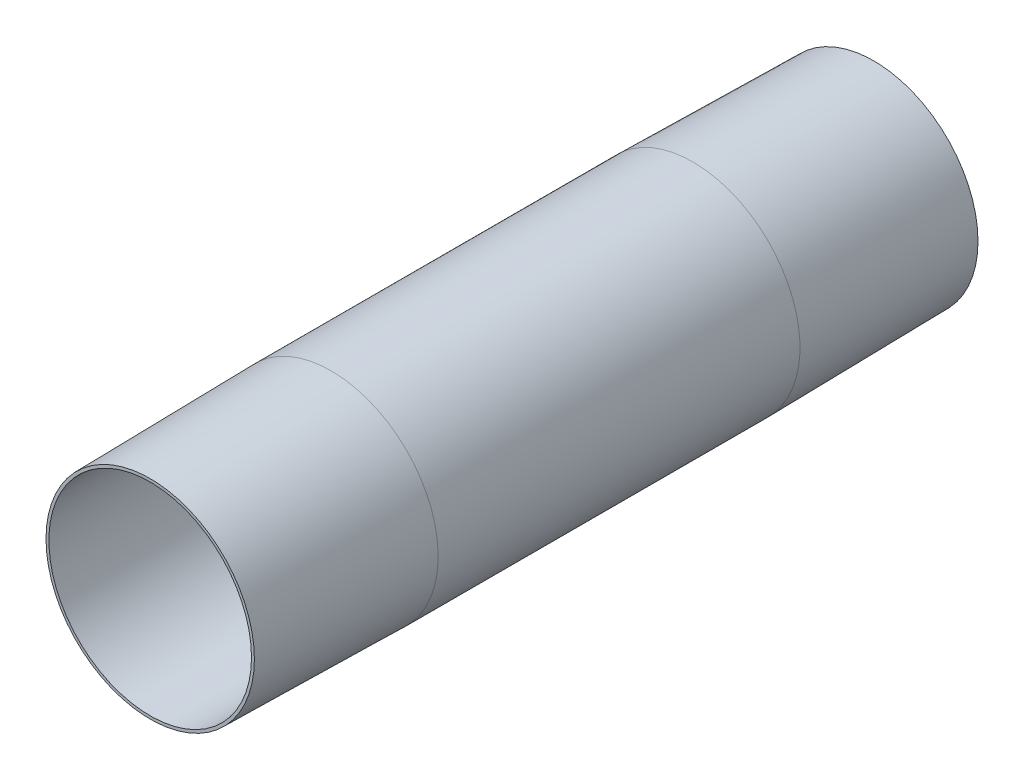
ISO-10303-21;
HEADER;
FILE_DESCRIPTION(('STEP AP214'),'2;1');
FILE_NAME('part.step','',(''),(''),'','','');
FILE_SCHEMA(('AUTOMOTIVE_DESIGN { 1 0 10303 214 1 1 1 1 }'));
ENDSEC;
DATA;
#1=APPLICATION_CONTEXT('core data for automotive mechanical design processes');
#2=APPLICATION_PROTOCOL_DEFINITION('international standard','automotive_design',2000,#1);
#3=PRODUCT_CONTEXT('',#1,'mechanical');
#4=PRODUCT('Part','Part','',(#3));
#5=PRODUCT_RELATED_PRODUCT_CATEGORY('part','',(#4));
#6=PRODUCT_DEFINITION_FORMATION('','',#4);
#7=PRODUCT_DEFINITION_CONTEXT('part definition',#1,'design');
#8=PRODUCT_DEFINITION('design','',#6,#7);
#9=PRODUCT_DEFINITION_SHAPE('','',#8);
#10=(LENGTH_UNIT() NAMED_UNIT(*) SI_UNIT(.MILLI.,.METRE.));
#11=(NAMED_UNIT(*) PLANE_ANGLE_UNIT() SI_UNIT($,.RADIAN.));
#12=(NAMED_UNIT(*) SI_UNIT($,.STERADIAN.) SOLID_ANGLE_UNIT());
#13=UNCERTAINTY_MEASURE_WITH_UNIT(LENGTH_MEASURE(1.E-05),#10,'distance_accuracy_value','');
#14=(GEOMETRIC_REPRESENTATION_CONTEXT(3) GLOBAL_UNCERTAINTY_ASSIGNED_CONTEXT((#13)) GLOBAL_UNIT_ASSIGNED_CONTEXT((#10,
#11,#12)) REPRESENTATION_CONTEXT('',''));
#15=CARTESIAN_POINT('',(0.,0.,0.));
#16=DIRECTION('',(0.,0.,1.));
#17=DIRECTION('',(1.,0.,0.));
#18=AXIS2_PLACEMENT_3D('',#15,#16,#17);
#19=CARTESIAN_POINT('',(0.,0.,500.));
#20=DIRECTION('',(0.,0.,1.));
#21=DIRECTION('',(1.,0.,0.));
#22=AXIS2_PLACEMENT_3D('',#19,#20,#21);
#23=PLANE('',#22);
#24=CARTESIAN_POINT('',(0.,0.,500.));
#25=DIRECTION('',(0.,0.,1.));
#26=DIRECTION('',(1.,0.,0.));
#27=AXIS2_PLACEMENT_3D('',#24,#25,#26);
#28=CIRCLE('',#27,70.);
#29=CARTESIAN_POINT('',(70.,0.,500.));
#30=VERTEX_POINT('',#29);
#31=EDGE_CURVE('E10',#30,#30,#28,.T.);
#32=ORIENTED_EDGE('',*,*,#31,.F.);
#33=EDGE_LOOP('',(#32));
#34=FACE_BOUND('',#33,.T.);
#35=CARTESIAN_POINT('',(0.,0.,500.));
#36=DIRECTION('',(0.,0.,-1.));
#37=DIRECTION('',(-1.,0.,0.));
#38=AXIS2_PLACEMENT_3D('',#35,#36,#37);
#39=CIRCLE('',#38,72.);
#40=CARTESIAN_POINT('',(-72.,0.,500.));
#41=VERTEX_POINT('',#40);
#42=EDGE_CURVE('E45',#41,#41,#39,.T.);
#43=ORIENTED_EDGE('',*,*,#42,.F.);
#44=EDGE_LOOP('',(#43));
#45=FACE_BOUND('',#44,.T.);
#46=ADVANCED_FACE('F32',(#34,#45),#23,.T.);
#47=CARTESIAN_POINT('',(0.,0.,0.));
#48=DIRECTION('',(0.,0.,1.));
#49=DIRECTION('',(1.,0.,0.));
#50=AXIS2_PLACEMENT_3D('',#47,#48,#49);
#51=PLANE('',#50);
#52=CARTESIAN_POINT('',(0.,0.,0.));
#53=DIRECTION('',(0.,0.,-1.));
#54=DIRECTION('',(-1.,0.,0.));
#55=AXIS2_PLACEMENT_3D('',#52,#53,#54);
#56=CIRCLE('',#55,72.);
#57=CARTESIAN_POINT('',(-72.,0.,0.));
#58=VERTEX_POINT('',#57);
#59=EDGE_CURVE('E43',#58,#58,#56,.T.);
#60=ORIENTED_EDGE('',*,*,#59,.T.);
#61=EDGE_LOOP('',(#60));
#62=FACE_BOUND('',#61,.T.);
#63=CARTESIAN_POINT('',(0.,0.,0.));
#64=DIRECTION('',(0.,0.,1.));
#65=DIRECTION('',(1.,0.,0.));
#66=AXIS2_PLACEMENT_3D('',#63,#64,#65);
#67=CIRCLE('',#66,70.);
#68=CARTESIAN_POINT('',(70.,0.,0.));
#69=VERTEX_POINT('',#68);
#70=EDGE_CURVE('E36',#69,#69,#67,.T.);
#71=ORIENTED_EDGE('',*,*,#70,.T.);
#72=EDGE_LOOP('',(#71));
#73=FACE_BOUND('',#72,.T.);
#74=ADVANCED_FACE('F71',(#62,#73),#51,.F.);
#75=CARTESIAN_POINT('',(0.,0.,500.));
#76=DIRECTION('',(0.,0.,-1.));
#77=DIRECTION('',(-1.,0.,0.));
#78=AXIS2_PLACEMENT_3D('',#75,#76,#77);
#79=CYLINDRICAL_SURFACE('',#78,70.);
#80=ORIENTED_EDGE('',*,*,#31,.T.);
#81=EDGE_LOOP('',(#80));
#82=FACE_BOUND('',#81,.T.);
#83=ORIENTED_EDGE('',*,*,#70,.F.);
#84=EDGE_LOOP('',(#83));
#85=FACE_BOUND('',#84,.T.);
#86=ADVANCED_FACE('F66',(#82,#85),#79,.F.);
#87=CARTESIAN_POINT('',(0.,0.,500.));
#88=DIRECTION('',(0.,0.,-1.));
#89=DIRECTION('',(-1.,0.,0.));
#90=AXIS2_PLACEMENT_3D('',#87,#88,#89);
#91=CONICAL_SURFACE('',#90,72.,0.015998634876344);
#92=CARTESIAN_POINT('',(0.,0.,375.));
#93=DIRECTION('',(0.,0.,-1.));
#94=DIRECTION('',(-1.,0.,0.));
#95=AXIS2_PLACEMENT_3D('',#92,#93,#94);
#96=CIRCLE('',#95,74.);
#97=CARTESIAN_POINT('',(-74.,0.,375.));
#98=VERTEX_POINT('',#97);
#99=EDGE_CURVE('E49',#98,#98,#96,.T.);
#100=ORIENTED_EDGE('',*,*,#99,.F.);
#101=EDGE_LOOP('',(#100));
#102=FACE_BOUND('',#101,.T.);
#103=ORIENTED_EDGE('',*,*,#42,.T.);
#104=EDGE_LOOP('',(#103));
#105=FACE_BOUND('',#104,.T.);
#106=ADVANCED_FACE('F63',(#102,#105),#91,.T.);
#107=CARTESIAN_POINT('',(0.,0.,125.));
#108=DIRECTION('',(0.,0.,1.));
#109=DIRECTION('',(1.,0.,0.));
#110=AXIS2_PLACEMENT_3D('',#107,#108,#109);
#111=CONICAL_SURFACE('',#110,74.,0.0159986348763437);
#112=ORIENTED_EDGE('',*,*,#59,.F.);
#113=EDGE_LOOP('',(#112));
#114=FACE_BOUND('',#113,.T.);
#115=CARTESIAN_POINT('',(0.,0.,125.));
#116=DIRECTION('',(0.,0.,-1.));
#117=DIRECTION('',(-1.,0.,0.));
#118=AXIS2_PLACEMENT_3D('',#115,#116,#117);
#119=CIRCLE('',#118,74.);
#120=CARTESIAN_POINT('',(-74.,0.,125.));
#121=VERTEX_POINT('',#120);
#122=EDGE_CURVE('E48',#121,#121,#119,.T.);
#123=ORIENTED_EDGE('',*,*,#122,.T.);
#124=EDGE_LOOP('',(#123));
#125=FACE_BOUND('',#124,.T.);
#126=ADVANCED_FACE('F57',(#114,#125),#111,.T.);
#127=CARTESIAN_POINT('',(0.,0.,500.));
#128=DIRECTION('',(0.,0.,-1.));
#129=DIRECTION('',(-1.,0.,0.));
#130=AXIS2_PLACEMENT_3D('',#127,#128,#129);
#131=CYLINDRICAL_SURFACE('',#130,74.);
#132=ORIENTED_EDGE('',*,*,#122,.F.);
#133=EDGE_LOOP('',(#132));
#134=FACE_BOUND('',#133,.T.);
#135=ORIENTED_EDGE('',*,*,#99,.T.);
#136=EDGE_LOOP('',(#135));
#137=FACE_BOUND('',#136,.T.);
#138=ADVANCED_FACE('F34',(#134,#137),#131,.T.);
#139=CLOSED_SHELL('',(#46,#74,#86,#106,#126,#138));
#140=MANIFOLD_SOLID_BREP('B2',#139);
#141=ADVANCED_BREP_SHAPE_REPRESENTATION('',(#18,#140),#14);
#142=SHAPE_DEFINITION_REPRESENTATION(#9,#141);
ENDSEC;
END-ISO-10303-21;
